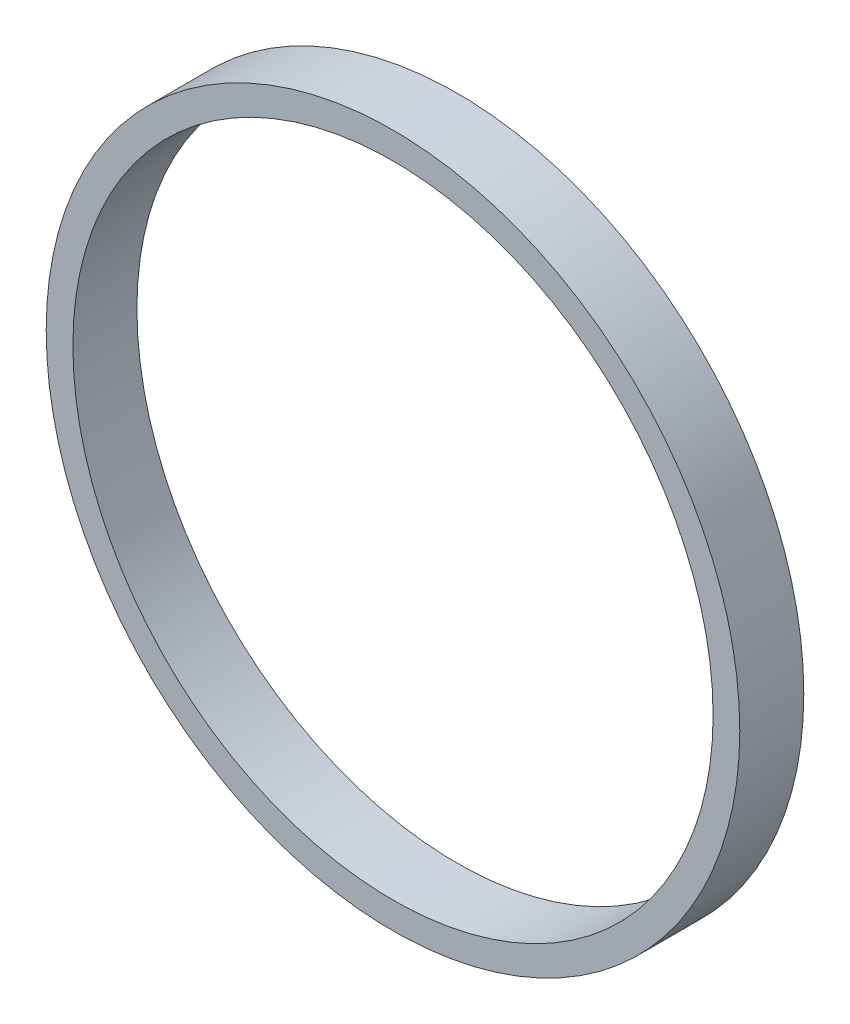
ISO-10303-21;
HEADER;
FILE_DESCRIPTION(('STEP AP214'),'2;1');
FILE_NAME('part.step','',(''),(''),'','','');
FILE_SCHEMA(('AUTOMOTIVE_DESIGN { 1 0 10303 214 1 1 1 1 }'));
ENDSEC;
DATA;
#1=APPLICATION_CONTEXT('core data for automotive mechanical design processes');
#2=APPLICATION_PROTOCOL_DEFINITION('international standard','automotive_design',2000,#1);
#3=PRODUCT_CONTEXT('',#1,'mechanical');
#4=PRODUCT('Part','Part','',(#3));
#5=PRODUCT_RELATED_PRODUCT_CATEGORY('part','',(#4));
#6=PRODUCT_DEFINITION_FORMATION('','',#4);
#7=PRODUCT_DEFINITION_CONTEXT('part definition',#1,'design');
#8=PRODUCT_DEFINITION('design','',#6,#7);
#9=PRODUCT_DEFINITION_SHAPE('','',#8);
#10=(LENGTH_UNIT() NAMED_UNIT(*) SI_UNIT(.MILLI.,.METRE.));
#11=(NAMED_UNIT(*) PLANE_ANGLE_UNIT() SI_UNIT($,.RADIAN.));
#12=(NAMED_UNIT(*) SI_UNIT($,.STERADIAN.) SOLID_ANGLE_UNIT());
#13=UNCERTAINTY_MEASURE_WITH_UNIT(LENGTH_MEASURE(1.E-05),#10,'distance_accuracy_value','');
#14=(GEOMETRIC_REPRESENTATION_CONTEXT(3) GLOBAL_UNCERTAINTY_ASSIGNED_CONTEXT((#13)) GLOBAL_UNIT_ASSIGNED_CONTEXT((#10,
#11,#12)) REPRESENTATION_CONTEXT('',''));
#15=CARTESIAN_POINT('',(0.,0.,0.));
#16=DIRECTION('',(0.,0.,1.));
#17=DIRECTION('',(1.,0.,0.));
#18=AXIS2_PLACEMENT_3D('',#15,#16,#17);
#19=CARTESIAN_POINT('',(0.,0.,3.));
#20=DIRECTION('',(0.,0.,1.));
#21=DIRECTION('',(1.,0.,0.));
#22=AXIS2_PLACEMENT_3D('',#19,#20,#21);
#23=PLANE('',#22);
#24=CARTESIAN_POINT('',(0.,0.,3.));
#25=DIRECTION('',(0.,0.,1.));
#26=DIRECTION('',(1.,0.,0.));
#27=AXIS2_PLACEMENT_3D('',#24,#25,#26);
#28=CIRCLE('',#27,32.5);
#29=CARTESIAN_POINT('',(32.5,0.,3.));
#30=VERTEX_POINT('',#29);
#31=EDGE_CURVE('E10',#30,#30,#28,.T.);
#32=ORIENTED_EDGE('',*,*,#31,.T.);
#33=EDGE_LOOP('',(#32));
#34=FACE_BOUND('',#33,.T.);
#35=CARTESIAN_POINT('',(0.,0.,3.));
#36=DIRECTION('',(0.,0.,1.));
#37=DIRECTION('',(1.,0.,0.));
#38=AXIS2_PLACEMENT_3D('',#35,#36,#37);
#39=CIRCLE('',#38,30.);
#40=CARTESIAN_POINT('',(30.,0.,3.));
#41=VERTEX_POINT('',#40);
#42=EDGE_CURVE('E46',#41,#41,#39,.T.);
#43=ORIENTED_EDGE('',*,*,#42,.F.);
#44=EDGE_LOOP('',(#43));
#45=FACE_BOUND('',#44,.T.);
#46=ADVANCED_FACE('F35',(#34,#45),#23,.T.);
#47=CARTESIAN_POINT('',(0.,0.,-3.));
#48=DIRECTION('',(0.,0.,1.));
#49=DIRECTION('',(1.,0.,0.));
#50=AXIS2_PLACEMENT_3D('',#47,#48,#49);
#51=PLANE('',#50);
#52=CARTESIAN_POINT('',(0.,0.,-3.));
#53=DIRECTION('',(0.,0.,1.));
#54=DIRECTION('',(1.,0.,0.));
#55=AXIS2_PLACEMENT_3D('',#52,#53,#54);
#56=CIRCLE('',#55,32.5);
#57=CARTESIAN_POINT('',(32.5,0.,-3.));
#58=VERTEX_POINT('',#57);
#59=EDGE_CURVE('E39',#58,#58,#56,.T.);
#60=ORIENTED_EDGE('',*,*,#59,.F.);
#61=EDGE_LOOP('',(#60));
#62=FACE_BOUND('',#61,.T.);
#63=CARTESIAN_POINT('',(0.,0.,-3.));
#64=DIRECTION('',(0.,0.,1.));
#65=DIRECTION('',(1.,0.,0.));
#66=AXIS2_PLACEMENT_3D('',#63,#64,#65);
#67=CIRCLE('',#66,30.);
#68=CARTESIAN_POINT('',(30.,0.,-3.));
#69=VERTEX_POINT('',#68);
#70=EDGE_CURVE('E48',#69,#69,#67,.T.);
#71=ORIENTED_EDGE('',*,*,#70,.T.);
#72=EDGE_LOOP('',(#71));
#73=FACE_BOUND('',#72,.T.);
#74=ADVANCED_FACE('F58',(#62,#73),#51,.F.);
#75=CARTESIAN_POINT('',(0.,0.,3.));
#76=DIRECTION('',(0.,0.,-1.));
#77=DIRECTION('',(-1.,0.,0.));
#78=AXIS2_PLACEMENT_3D('',#75,#76,#77);
#79=CYLINDRICAL_SURFACE('',#78,32.5);
#80=ORIENTED_EDGE('',*,*,#31,.F.);
#81=EDGE_LOOP('',(#80));
#82=FACE_BOUND('',#81,.T.);
#83=ORIENTED_EDGE('',*,*,#59,.T.);
#84=EDGE_LOOP('',(#83));
#85=FACE_BOUND('',#84,.T.);
#86=ADVANCED_FACE('F37',(#82,#85),#79,.T.);
#87=CARTESIAN_POINT('',(0.,0.,3.));
#88=DIRECTION('',(0.,0.,-1.));
#89=DIRECTION('',(-1.,0.,0.));
#90=AXIS2_PLACEMENT_3D('',#87,#88,#89);
#91=CYLINDRICAL_SURFACE('',#90,30.);
#92=ORIENTED_EDGE('',*,*,#42,.T.);
#93=EDGE_LOOP('',(#92));
#94=FACE_BOUND('',#93,.T.);
#95=ORIENTED_EDGE('',*,*,#70,.F.);
#96=EDGE_LOOP('',(#95));
#97=FACE_BOUND('',#96,.T.);
#98=ADVANCED_FACE('F54',(#94,#97),#91,.F.);
#99=CLOSED_SHELL('',(#46,#74,#86,#98));
#100=MANIFOLD_SOLID_BREP('B2',#99);
#101=ADVANCED_BREP_SHAPE_REPRESENTATION('',(#18,#100),#14);
#102=SHAPE_DEFINITION_REPRESENTATION(#9,#101);
ENDSEC;
END-ISO-10303-21;
